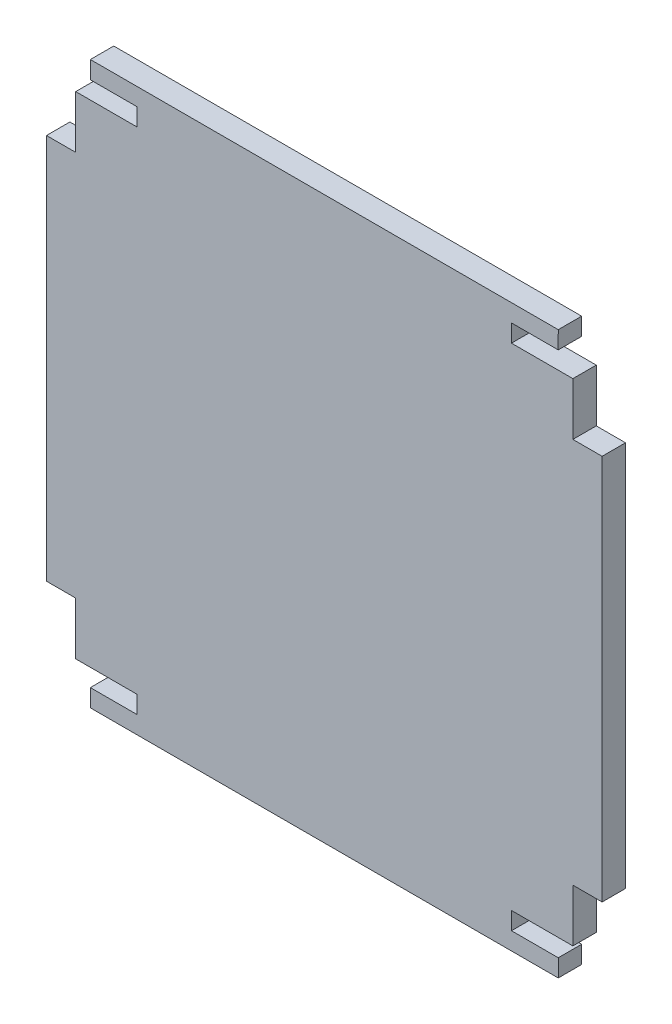
ISO-10303-21;
HEADER;
FILE_DESCRIPTION(('STEP AP214'),'2;1');
FILE_NAME('part.step','',(''),(''),'','','');
FILE_SCHEMA(('AUTOMOTIVE_DESIGN { 1 0 10303 214 1 1 1 1 }'));
ENDSEC;
DATA;
#1=APPLICATION_CONTEXT('core data for automotive mechanical design processes');
#2=APPLICATION_PROTOCOL_DEFINITION('international standard','automotive_design',2000,#1);
#3=PRODUCT_CONTEXT('',#1,'mechanical');
#4=PRODUCT('Part','Part','',(#3));
#5=PRODUCT_RELATED_PRODUCT_CATEGORY('part','',(#4));
#6=PRODUCT_DEFINITION_FORMATION('','',#4);
#7=PRODUCT_DEFINITION_CONTEXT('part definition',#1,'design');
#8=PRODUCT_DEFINITION('design','',#6,#7);
#9=PRODUCT_DEFINITION_SHAPE('','',#8);
#10=(LENGTH_UNIT() NAMED_UNIT(*) SI_UNIT(.MILLI.,.METRE.));
#11=(NAMED_UNIT(*) PLANE_ANGLE_UNIT() SI_UNIT($,.RADIAN.));
#12=(NAMED_UNIT(*) SI_UNIT($,.STERADIAN.) SOLID_ANGLE_UNIT());
#13=UNCERTAINTY_MEASURE_WITH_UNIT(LENGTH_MEASURE(1.E-05),#10,'distance_accuracy_value','');
#14=(GEOMETRIC_REPRESENTATION_CONTEXT(3) GLOBAL_UNCERTAINTY_ASSIGNED_CONTEXT((#13)) GLOBAL_UNIT_ASSIGNED_CONTEXT((#10,
#11,#12)) REPRESENTATION_CONTEXT('',''));
#15=CARTESIAN_POINT('',(0.,0.,0.));
#16=DIRECTION('',(0.,0.,1.));
#17=DIRECTION('',(1.,0.,0.));
#18=AXIS2_PLACEMENT_3D('',#15,#16,#17);
#19=CARTESIAN_POINT('',(-42.4999999508285,41.9999999081954,4.));
#20=DIRECTION('',(1.7486584931381E-08,-1.,0.));
#21=DIRECTION('',(1.,1.7486584931381E-08,0.));
#22=AXIS2_PLACEMENT_3D('',#19,#20,#21);
#23=PLANE('',#22);
#24=DIRECTION('',(-1.,-1.7486584931381E-08,0.));
#25=VECTOR('',#24,1.);
#26=CARTESIAN_POINT('',(-42.4999999508285,41.9999999081954,0.));
#27=LINE('',#26,#25);
#28=CARTESIAN_POINT('',(-31.9999999508282,42.0000000918045,0.));
#29=VERTEX_POINT('',#28);
#30=CARTESIAN_POINT('',(-42.4999999508285,41.9999999081954,0.));
#31=VERTEX_POINT('',#30);
#32=EDGE_CURVE('E257',#29,#31,#27,.T.);
#33=ORIENTED_EDGE('',*,*,#32,.T.);
#34=DIRECTION('',(0.,0.,-1.));
#35=VECTOR('',#34,1.);
#36=CARTESIAN_POINT('',(-42.4999999508285,41.9999999081954,4.));
#37=LINE('',#36,#35);
#38=CARTESIAN_POINT('',(-42.4999999508285,41.9999999081954,4.));
#39=VERTEX_POINT('',#38);
#40=EDGE_CURVE('E11',#39,#31,#37,.T.);
#41=ORIENTED_EDGE('',*,*,#40,.F.);
#42=DIRECTION('',(-1.,-1.7486584931381E-08,0.));
#43=VECTOR('',#42,1.);
#44=CARTESIAN_POINT('',(-42.4999999508285,41.9999999081954,4.));
#45=LINE('',#44,#43);
#46=CARTESIAN_POINT('',(-31.9999999508282,42.0000000918045,4.));
#47=VERTEX_POINT('',#46);
#48=EDGE_CURVE('E311',#47,#39,#45,.T.);
#49=ORIENTED_EDGE('',*,*,#48,.F.);
#50=DIRECTION('',(0.,0.,-1.));
#51=VECTOR('',#50,1.);
#52=CARTESIAN_POINT('',(-31.9999999508282,42.0000000918045,4.));
#53=LINE('',#52,#51);
#54=EDGE_CURVE('E253',#47,#29,#53,.T.);
#55=ORIENTED_EDGE('',*,*,#54,.T.);
#56=EDGE_LOOP('',(#33,#41,#49,#55));
#57=FACE_BOUND('',#56,.T.);
#58=ADVANCED_FACE('F41',(#57),#23,.F.);
#59=CARTESIAN_POINT('',(-42.4999999508285,41.9999999081954,4.));
#60=DIRECTION('',(1.,0.,0.));
#61=DIRECTION('',(0.,0.,-1.));
#62=AXIS2_PLACEMENT_3D('',#59,#60,#61);
#63=PLANE('',#62);
#64=DIRECTION('',(0.,-1.,0.));
#65=VECTOR('',#64,1.);
#66=CARTESIAN_POINT('',(-42.4999999508285,41.9999999081954,0.));
#67=LINE('',#66,#65);
#68=CARTESIAN_POINT('',(-42.4999999508285,33.0000000918047,0.));
#69=VERTEX_POINT('',#68);
#70=EDGE_CURVE('E260',#31,#69,#67,.T.);
#71=ORIENTED_EDGE('',*,*,#70,.T.);
#72=DIRECTION('',(0.,0.,-1.));
#73=VECTOR('',#72,1.);
#74=CARTESIAN_POINT('',(-42.4999999508285,33.0000000918047,4.));
#75=LINE('',#74,#73);
#76=CARTESIAN_POINT('',(-42.4999999508285,33.0000000918047,4.));
#77=VERTEX_POINT('',#76);
#78=EDGE_CURVE('E49',#77,#69,#75,.T.);
#79=ORIENTED_EDGE('',*,*,#78,.F.);
#80=DIRECTION('',(0.,-1.,0.));
#81=VECTOR('',#80,1.);
#82=CARTESIAN_POINT('',(-42.4999999508285,41.9999999081954,4.));
#83=LINE('',#82,#81);
#84=EDGE_CURVE('E160',#39,#77,#83,.T.);
#85=ORIENTED_EDGE('',*,*,#84,.F.);
#86=ORIENTED_EDGE('',*,*,#40,.T.);
#87=EDGE_LOOP('',(#71,#79,#85,#86));
#88=FACE_BOUND('',#87,.T.);
#89=ADVANCED_FACE('F469',(#88),#63,.F.);
#90=CARTESIAN_POINT('',(-42.4999999508285,33.0000000918047,4.));
#91=DIRECTION('',(0.,-1.,0.));
#92=DIRECTION('',(1.,0.,0.));
#93=AXIS2_PLACEMENT_3D('',#90,#91,#92);
#94=PLANE('',#93);
#95=DIRECTION('',(-1.,0.,0.));
#96=VECTOR('',#95,1.);
#97=CARTESIAN_POINT('',(-42.4999999508285,33.0000000918047,0.));
#98=LINE('',#97,#96);
#99=CARTESIAN_POINT('',(-47.4999999508283,33.0000000918048,0.));
#100=VERTEX_POINT('',#99);
#101=EDGE_CURVE('E262',#69,#100,#98,.T.);
#102=ORIENTED_EDGE('',*,*,#101,.T.);
#103=DIRECTION('',(0.,0.,-1.));
#104=VECTOR('',#103,1.);
#105=CARTESIAN_POINT('',(-47.4999999508283,33.0000000918048,4.));
#106=LINE('',#105,#104);
#107=CARTESIAN_POINT('',(-47.4999999508283,33.0000000918048,4.));
#108=VERTEX_POINT('',#107);
#109=EDGE_CURVE('E378',#108,#100,#106,.T.);
#110=ORIENTED_EDGE('',*,*,#109,.F.);
#111=DIRECTION('',(-1.,0.,0.));
#112=VECTOR('',#111,1.);
#113=CARTESIAN_POINT('',(-42.4999999508285,33.0000000918047,4.));
#114=LINE('',#113,#112);
#115=EDGE_CURVE('E386',#77,#108,#114,.T.);
#116=ORIENTED_EDGE('',*,*,#115,.F.);
#117=ORIENTED_EDGE('',*,*,#78,.T.);
#118=EDGE_LOOP('',(#102,#110,#116,#117));
#119=FACE_BOUND('',#118,.T.);
#120=ADVANCED_FACE('F384',(#119),#94,.F.);
#121=CARTESIAN_POINT('',(-47.4999999508283,33.0000000918048,4.));
#122=DIRECTION('',(1.,0.,0.));
#123=DIRECTION('',(0.,1.,0.));
#124=AXIS2_PLACEMENT_3D('',#121,#122,#123);
#125=PLANE('',#124);
#126=DIRECTION('',(0.,-1.,0.));
#127=VECTOR('',#126,1.);
#128=CARTESIAN_POINT('',(-47.4999999508283,33.0000000918048,0.));
#129=LINE('',#128,#127);
#130=CARTESIAN_POINT('',(-47.4999999508301,-32.9999999081952,0.));
#131=VERTEX_POINT('',#130);
#132=EDGE_CURVE('E264',#100,#131,#129,.T.);
#133=ORIENTED_EDGE('',*,*,#132,.T.);
#134=DIRECTION('',(0.,0.,-1.));
#135=VECTOR('',#134,1.);
#136=CARTESIAN_POINT('',(-47.4999999508301,-32.9999999081952,4.));
#137=LINE('',#136,#135);
#138=CARTESIAN_POINT('',(-47.4999999508301,-32.9999999081952,4.));
#139=VERTEX_POINT('',#138);
#140=EDGE_CURVE('E375',#139,#131,#137,.T.);
#141=ORIENTED_EDGE('',*,*,#140,.F.);
#142=DIRECTION('',(0.,-1.,0.));
#143=VECTOR('',#142,1.);
#144=CARTESIAN_POINT('',(-47.4999999508283,33.0000000918048,4.));
#145=LINE('',#144,#143);
#146=EDGE_CURVE('E404',#108,#139,#145,.T.);
#147=ORIENTED_EDGE('',*,*,#146,.F.);
#148=ORIENTED_EDGE('',*,*,#109,.T.);
#149=EDGE_LOOP('',(#133,#141,#147,#148));
#150=FACE_BOUND('',#149,.T.);
#151=ADVANCED_FACE('F395',(#150),#125,.F.);
#152=CARTESIAN_POINT('',(-47.4999999508301,-32.9999999081952,4.));
#153=DIRECTION('',(0.,1.,0.));
#154=DIRECTION('',(-1.,0.,0.));
#155=AXIS2_PLACEMENT_3D('',#152,#153,#154);
#156=PLANE('',#155);
#157=DIRECTION('',(1.,0.,0.));
#158=VECTOR('',#157,1.);
#159=CARTESIAN_POINT('',(-47.4999999508301,-32.9999999081952,0.));
#160=LINE('',#159,#158);
#161=CARTESIAN_POINT('',(-42.4999999508301,-32.9999999081953,0.));
#162=VERTEX_POINT('',#161);
#163=EDGE_CURVE('E266',#131,#162,#160,.T.);
#164=ORIENTED_EDGE('',*,*,#163,.T.);
#165=DIRECTION('',(0.,0.,-1.));
#166=VECTOR('',#165,1.);
#167=CARTESIAN_POINT('',(-42.4999999508301,-32.9999999081953,4.));
#168=LINE('',#167,#166);
#169=CARTESIAN_POINT('',(-42.4999999508301,-32.9999999081953,4.));
#170=VERTEX_POINT('',#169);
#171=EDGE_CURVE('E372',#170,#162,#168,.T.);
#172=ORIENTED_EDGE('',*,*,#171,.F.);
#173=DIRECTION('',(1.,0.,0.));
#174=VECTOR('',#173,1.);
#175=CARTESIAN_POINT('',(-47.4999999508301,-32.9999999081952,4.));
#176=LINE('',#175,#174);
#177=EDGE_CURVE('E401',#139,#170,#176,.T.);
#178=ORIENTED_EDGE('',*,*,#177,.F.);
#179=ORIENTED_EDGE('',*,*,#140,.T.);
#180=EDGE_LOOP('',(#164,#172,#178,#179));
#181=FACE_BOUND('',#180,.T.);
#182=ADVANCED_FACE('F399',(#181),#156,.F.);
#183=CARTESIAN_POINT('',(-42.4999999508301,-32.9999999081953,4.));
#184=DIRECTION('',(1.,1.74243335809224E-13,0.));
#185=DIRECTION('',(-1.74243335809224E-13,1.,0.));
#186=AXIS2_PLACEMENT_3D('',#183,#184,#185);
#187=PLANE('',#186);
#188=DIRECTION('',(1.74243335809224E-13,-1.,0.));
#189=VECTOR('',#188,1.);
#190=CARTESIAN_POINT('',(-42.4999999508301,-32.9999999081953,0.));
#191=LINE('',#190,#189);
#192=CARTESIAN_POINT('',(-42.4999999508285,-41.9999999081954,0.));
#193=VERTEX_POINT('',#192);
#194=EDGE_CURVE('E268',#162,#193,#191,.T.);
#195=ORIENTED_EDGE('',*,*,#194,.T.);
#196=DIRECTION('',(0.,0.,-1.));
#197=VECTOR('',#196,1.);
#198=CARTESIAN_POINT('',(-42.4999999508285,-41.9999999081954,4.));
#199=LINE('',#198,#197);
#200=CARTESIAN_POINT('',(-42.4999999508285,-41.9999999081954,4.));
#201=VERTEX_POINT('',#200);
#202=EDGE_CURVE('E369',#201,#193,#199,.T.);
#203=ORIENTED_EDGE('',*,*,#202,.F.);
#204=DIRECTION('',(1.74243335809224E-13,-1.,0.));
#205=VECTOR('',#204,1.);
#206=CARTESIAN_POINT('',(-42.4999999508301,-32.9999999081953,4.));
#207=LINE('',#206,#205);
#208=EDGE_CURVE('E403',#170,#201,#207,.T.);
#209=ORIENTED_EDGE('',*,*,#208,.F.);
#210=ORIENTED_EDGE('',*,*,#171,.T.);
#211=EDGE_LOOP('',(#195,#203,#209,#210));
#212=FACE_BOUND('',#211,.T.);
#213=ADVANCED_FACE('F482',(#212),#187,.F.);
#214=CARTESIAN_POINT('',(-42.4999999508285,-41.9999999081954,4.));
#215=DIRECTION('',(0.,1.,0.));
#216=DIRECTION('',(0.,0.,1.));
#217=AXIS2_PLACEMENT_3D('',#214,#215,#216);
#218=PLANE('',#217);
#219=DIRECTION('',(1.,0.,0.));
#220=VECTOR('',#219,1.);
#221=CARTESIAN_POINT('',(-42.4999999508285,-41.9999999081954,0.));
#222=LINE('',#221,#220);
#223=CARTESIAN_POINT('',(-31.9999999508307,-41.9999999081954,0.));
#224=VERTEX_POINT('',#223);
#225=EDGE_CURVE('E270',#193,#224,#222,.T.);
#226=ORIENTED_EDGE('',*,*,#225,.T.);
#227=DIRECTION('',(0.,0.,-1.));
#228=VECTOR('',#227,1.);
#229=CARTESIAN_POINT('',(-31.9999999508307,-41.9999999081954,4.));
#230=LINE('',#229,#228);
#231=CARTESIAN_POINT('',(-31.9999999508307,-41.9999999081954,4.));
#232=VERTEX_POINT('',#231);
#233=EDGE_CURVE('E366',#232,#224,#230,.T.);
#234=ORIENTED_EDGE('',*,*,#233,.F.);
#235=DIRECTION('',(1.,0.,0.));
#236=VECTOR('',#235,1.);
#237=CARTESIAN_POINT('',(-42.4999999508285,-41.9999999081954,4.));
#238=LINE('',#237,#236);
#239=EDGE_CURVE('E406',#201,#232,#238,.T.);
#240=ORIENTED_EDGE('',*,*,#239,.F.);
#241=ORIENTED_EDGE('',*,*,#202,.T.);
#242=EDGE_LOOP('',(#226,#234,#240,#241));
#243=FACE_BOUND('',#242,.T.);
#244=ADVANCED_FACE('F485',(#243),#218,.F.);
#245=CARTESIAN_POINT('',(-31.9999999508307,-41.9999999081954,4.));
#246=DIRECTION('',(1.,0.,0.));
#247=DIRECTION('',(0.,1.,0.));
#248=AXIS2_PLACEMENT_3D('',#245,#246,#247);
#249=PLANE('',#248);
#250=DIRECTION('',(0.,-1.,0.));
#251=VECTOR('',#250,1.);
#252=CARTESIAN_POINT('',(-31.9999999508307,-41.9999999081954,0.));
#253=LINE('',#252,#251);
#254=CARTESIAN_POINT('',(-31.9999999508308,-44.9999999081954,0.));
#255=VERTEX_POINT('',#254);
#256=EDGE_CURVE('E272',#224,#255,#253,.T.);
#257=ORIENTED_EDGE('',*,*,#256,.T.);
#258=DIRECTION('',(0.,0.,-1.));
#259=VECTOR('',#258,1.);
#260=CARTESIAN_POINT('',(-31.9999999508308,-44.9999999081954,4.));
#261=LINE('',#260,#259);
#262=CARTESIAN_POINT('',(-31.9999999508308,-44.9999999081954,4.));
#263=VERTEX_POINT('',#262);
#264=EDGE_CURVE('E363',#263,#255,#261,.T.);
#265=ORIENTED_EDGE('',*,*,#264,.F.);
#266=DIRECTION('',(0.,-1.,0.));
#267=VECTOR('',#266,1.);
#268=CARTESIAN_POINT('',(-31.9999999508307,-41.9999999081954,4.));
#269=LINE('',#268,#267);
#270=EDGE_CURVE('E412',#232,#263,#269,.T.);
#271=ORIENTED_EDGE('',*,*,#270,.F.);
#272=ORIENTED_EDGE('',*,*,#233,.T.);
#273=EDGE_LOOP('',(#257,#265,#271,#272));
#274=FACE_BOUND('',#273,.T.);
#275=ADVANCED_FACE('F489',(#274),#249,.F.);
#276=CARTESIAN_POINT('',(-39.9999999508304,-44.9999999081953,4.));
#277=DIRECTION('',(0.,-1.,0.));
#278=DIRECTION('',(1.,0.,0.));
#279=AXIS2_PLACEMENT_3D('',#276,#277,#278);
#280=PLANE('',#279);
#281=DIRECTION('',(-1.,0.,0.));
#282=VECTOR('',#281,1.);
#283=CARTESIAN_POINT('',(-39.9999999508304,-44.9999999081953,0.));
#284=LINE('',#283,#282);
#285=CARTESIAN_POINT('',(-39.9999999508304,-44.9999999081953,0.));
#286=VERTEX_POINT('',#285);
#287=EDGE_CURVE('E274',#255,#286,#284,.T.);
#288=ORIENTED_EDGE('',*,*,#287,.T.);
#289=DIRECTION('',(0.,0.,-1.));
#290=VECTOR('',#289,1.);
#291=CARTESIAN_POINT('',(-39.9999999508304,-44.9999999081953,4.));
#292=LINE('',#291,#290);
#293=CARTESIAN_POINT('',(-39.9999999508304,-44.9999999081953,4.));
#294=VERTEX_POINT('',#293);
#295=EDGE_CURVE('E360',#294,#286,#292,.T.);
#296=ORIENTED_EDGE('',*,*,#295,.F.);
#297=DIRECTION('',(-1.,0.,0.));
#298=VECTOR('',#297,1.);
#299=CARTESIAN_POINT('',(-39.9999999508304,-44.9999999081953,4.));
#300=LINE('',#299,#298);
#301=EDGE_CURVE('E414',#263,#294,#300,.T.);
#302=ORIENTED_EDGE('',*,*,#301,.F.);
#303=ORIENTED_EDGE('',*,*,#264,.T.);
#304=EDGE_LOOP('',(#288,#296,#302,#303));
#305=FACE_BOUND('',#304,.T.);
#306=ADVANCED_FACE('F493',(#305),#280,.F.);
#307=CARTESIAN_POINT('',(-39.9999999508304,-44.9999999081953,4.));
#308=DIRECTION('',(1.,0.,0.));
#309=DIRECTION('',(0.,1.,0.));
#310=AXIS2_PLACEMENT_3D('',#307,#308,#309);
#311=PLANE('',#310);
#312=DIRECTION('',(0.,-1.,0.));
#313=VECTOR('',#312,1.);
#314=CARTESIAN_POINT('',(-39.9999999508304,-44.9999999081953,0.));
#315=LINE('',#314,#313);
#316=CARTESIAN_POINT('',(-39.9999999508305,-47.9999999081953,0.));
#317=VERTEX_POINT('',#316);
#318=EDGE_CURVE('E276',#286,#317,#315,.T.);
#319=ORIENTED_EDGE('',*,*,#318,.T.);
#320=DIRECTION('',(0.,0.,-1.));
#321=VECTOR('',#320,1.);
#322=CARTESIAN_POINT('',(-39.9999999508305,-47.9999999081953,4.));
#323=LINE('',#322,#321);
#324=CARTESIAN_POINT('',(-39.9999999508305,-47.9999999081953,4.));
#325=VERTEX_POINT('',#324);
#326=EDGE_CURVE('E357',#325,#317,#323,.T.);
#327=ORIENTED_EDGE('',*,*,#326,.F.);
#328=DIRECTION('',(0.,-1.,0.));
#329=VECTOR('',#328,1.);
#330=CARTESIAN_POINT('',(-39.9999999508304,-44.9999999081953,4.));
#331=LINE('',#330,#329);
#332=EDGE_CURVE('E416',#294,#325,#331,.T.);
#333=ORIENTED_EDGE('',*,*,#332,.F.);
#334=ORIENTED_EDGE('',*,*,#295,.T.);
#335=EDGE_LOOP('',(#319,#327,#333,#334));
#336=FACE_BOUND('',#335,.T.);
#337=ADVANCED_FACE('F497',(#336),#311,.F.);
#338=CARTESIAN_POINT('',(-39.9999999508305,-47.9999999081953,4.));
#339=DIRECTION('',(0.,1.,0.));
#340=DIRECTION('',(0.,0.,1.));
#341=AXIS2_PLACEMENT_3D('',#338,#339,#340);
#342=PLANE('',#341);
#343=DIRECTION('',(1.,0.,0.));
#344=VECTOR('',#343,1.);
#345=CARTESIAN_POINT('',(-39.9999999508305,-47.9999999081953,0.));
#346=LINE('',#345,#344);
#347=CARTESIAN_POINT('',(40.0000000491695,-47.9999999081953,0.));
#348=VERTEX_POINT('',#347);
#349=EDGE_CURVE('E278',#317,#348,#346,.T.);
#350=ORIENTED_EDGE('',*,*,#349,.T.);
#351=DIRECTION('',(0.,0.,-1.));
#352=VECTOR('',#351,1.);
#353=CARTESIAN_POINT('',(40.0000000491695,-47.9999999081953,4.));
#354=LINE('',#353,#352);
#355=CARTESIAN_POINT('',(40.0000000491695,-47.9999999081953,4.));
#356=VERTEX_POINT('',#355);
#357=EDGE_CURVE('E354',#356,#348,#354,.T.);
#358=ORIENTED_EDGE('',*,*,#357,.F.);
#359=DIRECTION('',(1.,0.,0.));
#360=VECTOR('',#359,1.);
#361=CARTESIAN_POINT('',(-39.9999999508305,-47.9999999081953,4.));
#362=LINE('',#361,#360);
#363=EDGE_CURVE('E418',#325,#356,#362,.T.);
#364=ORIENTED_EDGE('',*,*,#363,.F.);
#365=ORIENTED_EDGE('',*,*,#326,.T.);
#366=EDGE_LOOP('',(#350,#358,#364,#365));
#367=FACE_BOUND('',#366,.T.);
#368=ADVANCED_FACE('F501',(#367),#342,.F.);
#369=CARTESIAN_POINT('',(40.0000000491695,-44.9999999081976,4.));
#370=DIRECTION('',(-1.,0.,0.));
#371=DIRECTION('',(0.,-1.,0.));
#372=AXIS2_PLACEMENT_3D('',#369,#370,#371);
#373=PLANE('',#372);
#374=DIRECTION('',(0.,1.,0.));
#375=VECTOR('',#374,1.);
#376=CARTESIAN_POINT('',(40.0000000491695,-44.9999999081976,0.));
#377=LINE('',#376,#375);
#378=CARTESIAN_POINT('',(40.0000000491695,-44.9999999081976,0.));
#379=VERTEX_POINT('',#378);
#380=EDGE_CURVE('E280',#348,#379,#377,.T.);
#381=ORIENTED_EDGE('',*,*,#380,.T.);
#382=DIRECTION('',(0.,0.,-1.));
#383=VECTOR('',#382,1.);
#384=CARTESIAN_POINT('',(40.0000000491695,-44.9999999081976,4.));
#385=LINE('',#384,#383);
#386=CARTESIAN_POINT('',(40.0000000491695,-44.9999999081976,4.));
#387=VERTEX_POINT('',#386);
#388=EDGE_CURVE('E351',#387,#379,#385,.T.);
#389=ORIENTED_EDGE('',*,*,#388,.F.);
#390=DIRECTION('',(0.,1.,0.));
#391=VECTOR('',#390,1.);
#392=CARTESIAN_POINT('',(40.0000000491695,-44.9999999081976,4.));
#393=LINE('',#392,#391);
#394=EDGE_CURVE('E420',#356,#387,#393,.T.);
#395=ORIENTED_EDGE('',*,*,#394,.F.);
#396=ORIENTED_EDGE('',*,*,#357,.T.);
#397=EDGE_LOOP('',(#381,#389,#395,#396));
#398=FACE_BOUND('',#397,.T.);
#399=ADVANCED_FACE('F505',(#398),#373,.F.);
#400=CARTESIAN_POINT('',(32.0000000491697,-44.9999999081971,4.));
#401=DIRECTION('',(0.,-1.,0.));
#402=DIRECTION('',(1.,0.,0.));
#403=AXIS2_PLACEMENT_3D('',#400,#401,#402);
#404=PLANE('',#403);
#405=DIRECTION('',(-1.,0.,0.));
#406=VECTOR('',#405,1.);
#407=CARTESIAN_POINT('',(32.0000000491697,-44.9999999081971,0.));
#408=LINE('',#407,#406);
#409=CARTESIAN_POINT('',(32.0000000491697,-44.9999999081971,0.));
#410=VERTEX_POINT('',#409);
#411=EDGE_CURVE('E282',#379,#410,#408,.T.);
#412=ORIENTED_EDGE('',*,*,#411,.T.);
#413=DIRECTION('',(0.,0.,-1.));
#414=VECTOR('',#413,1.);
#415=CARTESIAN_POINT('',(32.0000000491697,-44.9999999081971,4.));
#416=LINE('',#415,#414);
#417=CARTESIAN_POINT('',(32.0000000491697,-44.9999999081971,4.));
#418=VERTEX_POINT('',#417);
#419=EDGE_CURVE('E348',#418,#410,#416,.T.);
#420=ORIENTED_EDGE('',*,*,#419,.F.);
#421=DIRECTION('',(-1.,0.,0.));
#422=VECTOR('',#421,1.);
#423=CARTESIAN_POINT('',(32.0000000491697,-44.9999999081971,4.));
#424=LINE('',#423,#422);
#425=EDGE_CURVE('E422',#387,#418,#424,.T.);
#426=ORIENTED_EDGE('',*,*,#425,.F.);
#427=ORIENTED_EDGE('',*,*,#388,.T.);
#428=EDGE_LOOP('',(#412,#420,#426,#427));
#429=FACE_BOUND('',#428,.T.);
#430=ADVANCED_FACE('F509',(#429),#404,.F.);
#431=CARTESIAN_POINT('',(32.0000000491698,-41.9999999081971,4.));
#432=DIRECTION('',(-1.,0.,0.));
#433=DIRECTION('',(0.,-1.,0.));
#434=AXIS2_PLACEMENT_3D('',#431,#432,#433);
#435=PLANE('',#434);
#436=DIRECTION('',(0.,1.,0.));
#437=VECTOR('',#436,1.);
#438=CARTESIAN_POINT('',(32.0000000491698,-41.9999999081971,0.));
#439=LINE('',#438,#437);
#440=CARTESIAN_POINT('',(32.0000000491698,-41.9999999081971,0.));
#441=VERTEX_POINT('',#440);
#442=EDGE_CURVE('E284',#410,#441,#439,.T.);
#443=ORIENTED_EDGE('',*,*,#442,.T.);
#444=DIRECTION('',(0.,0.,-1.));
#445=VECTOR('',#444,1.);
#446=CARTESIAN_POINT('',(32.0000000491698,-41.9999999081971,4.));
#447=LINE('',#446,#445);
#448=CARTESIAN_POINT('',(32.0000000491698,-41.9999999081971,4.));
#449=VERTEX_POINT('',#448);
#450=EDGE_CURVE('E345',#449,#441,#447,.T.);
#451=ORIENTED_EDGE('',*,*,#450,.F.);
#452=DIRECTION('',(0.,1.,0.));
#453=VECTOR('',#452,1.);
#454=CARTESIAN_POINT('',(32.0000000491698,-41.9999999081971,4.));
#455=LINE('',#454,#453);
#456=EDGE_CURVE('E424',#418,#449,#455,.T.);
#457=ORIENTED_EDGE('',*,*,#456,.F.);
#458=ORIENTED_EDGE('',*,*,#419,.T.);
#459=EDGE_LOOP('',(#443,#451,#457,#458));
#460=FACE_BOUND('',#459,.T.);
#461=ADVANCED_FACE('F513',(#460),#435,.F.);
#462=CARTESIAN_POINT('',(42.4999999508285,-41.9999999081954,4.));
#463=DIRECTION('',(-1.63890067074872E-13,1.,0.));
#464=DIRECTION('',(-1.,-1.63890067074872E-13,0.));
#465=AXIS2_PLACEMENT_3D('',#462,#463,#464);
#466=PLANE('',#465);
#467=DIRECTION('',(1.,1.63890067074872E-13,0.));
#468=VECTOR('',#467,1.);
#469=CARTESIAN_POINT('',(42.4999999508285,-41.9999999081954,0.));
#470=LINE('',#469,#468);
#471=CARTESIAN_POINT('',(42.4999999508285,-41.9999999081954,0.));
#472=VERTEX_POINT('',#471);
#473=EDGE_CURVE('E286',#441,#472,#470,.T.);
#474=ORIENTED_EDGE('',*,*,#473,.T.);
#475=DIRECTION('',(0.,0.,-1.));
#476=VECTOR('',#475,1.);
#477=CARTESIAN_POINT('',(42.4999999508285,-41.9999999081954,4.));
#478=LINE('',#477,#476);
#479=CARTESIAN_POINT('',(42.4999999508285,-41.9999999081954,4.));
#480=VERTEX_POINT('',#479);
#481=EDGE_CURVE('E342',#480,#472,#478,.T.);
#482=ORIENTED_EDGE('',*,*,#481,.F.);
#483=DIRECTION('',(1.,1.63890067074872E-13,0.));
#484=VECTOR('',#483,1.);
#485=CARTESIAN_POINT('',(42.4999999508285,-41.9999999081954,4.));
#486=LINE('',#485,#484);
#487=EDGE_CURVE('E426',#449,#480,#486,.T.);
#488=ORIENTED_EDGE('',*,*,#487,.F.);
#489=ORIENTED_EDGE('',*,*,#450,.T.);
#490=EDGE_LOOP('',(#474,#482,#488,#489));
#491=FACE_BOUND('',#490,.T.);
#492=ADVANCED_FACE('F517',(#491),#466,.F.);
#493=CARTESIAN_POINT('',(42.5000000491701,-32.9999999081977,4.));
#494=DIRECTION('',(-1.,1.09268365960335E-08,0.));
#495=DIRECTION('',(-1.09268365960335E-08,-1.,0.));
#496=AXIS2_PLACEMENT_3D('',#493,#494,#495);
#497=PLANE('',#496);
#498=DIRECTION('',(1.09268365960335E-08,1.,0.));
#499=VECTOR('',#498,1.);
#500=CARTESIAN_POINT('',(42.5000000491701,-32.9999999081977,0.));
#501=LINE('',#500,#499);
#502=CARTESIAN_POINT('',(42.5000000491701,-32.9999999081977,0.));
#503=VERTEX_POINT('',#502);
#504=EDGE_CURVE('E288',#472,#503,#501,.T.);
#505=ORIENTED_EDGE('',*,*,#504,.T.);
#506=DIRECTION('',(0.,0.,-1.));
#507=VECTOR('',#506,1.);
#508=CARTESIAN_POINT('',(42.5000000491701,-32.9999999081977,4.));
#509=LINE('',#508,#507);
#510=CARTESIAN_POINT('',(42.5000000491701,-32.9999999081977,4.));
#511=VERTEX_POINT('',#510);
#512=EDGE_CURVE('E339',#511,#503,#509,.T.);
#513=ORIENTED_EDGE('',*,*,#512,.F.);
#514=DIRECTION('',(1.09268365960335E-08,1.,0.));
#515=VECTOR('',#514,1.);
#516=CARTESIAN_POINT('',(42.5000000491701,-32.9999999081977,4.));
#517=LINE('',#516,#515);
#518=EDGE_CURVE('E428',#480,#511,#517,.T.);
#519=ORIENTED_EDGE('',*,*,#518,.F.);
#520=ORIENTED_EDGE('',*,*,#481,.T.);
#521=EDGE_LOOP('',(#505,#513,#519,#520));
#522=FACE_BOUND('',#521,.T.);
#523=ADVANCED_FACE('F521',(#522),#497,.F.);
#524=CARTESIAN_POINT('',(47.5000000491699,-32.9999999081978,4.));
#525=DIRECTION('',(0.,1.,0.));
#526=DIRECTION('',(-1.,0.,0.));
#527=AXIS2_PLACEMENT_3D('',#524,#525,#526);
#528=PLANE('',#527);
#529=DIRECTION('',(1.,0.,0.));
#530=VECTOR('',#529,1.);
#531=CARTESIAN_POINT('',(47.5000000491699,-32.9999999081978,0.));
#532=LINE('',#531,#530);
#533=CARTESIAN_POINT('',(47.5000000491699,-32.9999999081978,0.));
#534=VERTEX_POINT('',#533);
#535=EDGE_CURVE('E290',#503,#534,#532,.T.);
#536=ORIENTED_EDGE('',*,*,#535,.T.);
#537=DIRECTION('',(0.,0.,-1.));
#538=VECTOR('',#537,1.);
#539=CARTESIAN_POINT('',(47.5000000491699,-32.9999999081978,4.));
#540=LINE('',#539,#538);
#541=CARTESIAN_POINT('',(47.5000000491699,-32.9999999081978,4.));
#542=VERTEX_POINT('',#541);
#543=EDGE_CURVE('E336',#542,#534,#540,.T.);
#544=ORIENTED_EDGE('',*,*,#543,.F.);
#545=DIRECTION('',(1.,0.,0.));
#546=VECTOR('',#545,1.);
#547=CARTESIAN_POINT('',(47.5000000491699,-32.9999999081978,4.));
#548=LINE('',#547,#546);
#549=EDGE_CURVE('E430',#511,#542,#548,.T.);
#550=ORIENTED_EDGE('',*,*,#549,.F.);
#551=ORIENTED_EDGE('',*,*,#512,.T.);
#552=EDGE_LOOP('',(#536,#544,#550,#551));
#553=FACE_BOUND('',#552,.T.);
#554=ADVANCED_FACE('F525',(#553),#528,.F.);
#555=CARTESIAN_POINT('',(47.5000000491716,33.0000000918022,4.));
#556=DIRECTION('',(-1.,0.,0.));
#557=DIRECTION('',(0.,-1.,0.));
#558=AXIS2_PLACEMENT_3D('',#555,#556,#557);
#559=PLANE('',#558);
#560=DIRECTION('',(0.,1.,0.));
#561=VECTOR('',#560,1.);
#562=CARTESIAN_POINT('',(47.5000000491716,33.0000000918022,0.));
#563=LINE('',#562,#561);
#564=CARTESIAN_POINT('',(47.5000000491716,33.0000000918022,0.));
#565=VERTEX_POINT('',#564);
#566=EDGE_CURVE('E292',#534,#565,#563,.T.);
#567=ORIENTED_EDGE('',*,*,#566,.T.);
#568=DIRECTION('',(0.,0.,-1.));
#569=VECTOR('',#568,1.);
#570=CARTESIAN_POINT('',(47.5000000491716,33.0000000918022,4.));
#571=LINE('',#570,#569);
#572=CARTESIAN_POINT('',(47.5000000491716,33.0000000918022,4.));
#573=VERTEX_POINT('',#572);
#574=EDGE_CURVE('E333',#573,#565,#571,.T.);
#575=ORIENTED_EDGE('',*,*,#574,.F.);
#576=DIRECTION('',(0.,1.,0.));
#577=VECTOR('',#576,1.);
#578=CARTESIAN_POINT('',(47.5000000491716,33.0000000918022,4.));
#579=LINE('',#578,#577);
#580=EDGE_CURVE('E432',#542,#573,#579,.T.);
#581=ORIENTED_EDGE('',*,*,#580,.F.);
#582=ORIENTED_EDGE('',*,*,#543,.T.);
#583=EDGE_LOOP('',(#567,#575,#581,#582));
#584=FACE_BOUND('',#583,.T.);
#585=ADVANCED_FACE('F529',(#584),#559,.F.);
#586=CARTESIAN_POINT('',(42.5000000491716,33.0000000918023,4.));
#587=DIRECTION('',(0.,-1.,0.));
#588=DIRECTION('',(1.,0.,0.));
#589=AXIS2_PLACEMENT_3D('',#586,#587,#588);
#590=PLANE('',#589);
#591=DIRECTION('',(-1.,0.,0.));
#592=VECTOR('',#591,1.);
#593=CARTESIAN_POINT('',(42.5000000491716,33.0000000918023,0.));
#594=LINE('',#593,#592);
#595=CARTESIAN_POINT('',(42.5000000491716,33.0000000918023,0.));
#596=VERTEX_POINT('',#595);
#597=EDGE_CURVE('E294',#565,#596,#594,.T.);
#598=ORIENTED_EDGE('',*,*,#597,.T.);
#599=DIRECTION('',(0.,0.,-1.));
#600=VECTOR('',#599,1.);
#601=CARTESIAN_POINT('',(42.5000000491716,33.0000000918023,4.));
#602=LINE('',#601,#600);
#603=CARTESIAN_POINT('',(42.5000000491716,33.0000000918023,4.));
#604=VERTEX_POINT('',#603);
#605=EDGE_CURVE('E330',#604,#596,#602,.T.);
#606=ORIENTED_EDGE('',*,*,#605,.F.);
#607=DIRECTION('',(-1.,0.,0.));
#608=VECTOR('',#607,1.);
#609=CARTESIAN_POINT('',(42.5000000491716,33.0000000918023,4.));
#610=LINE('',#609,#608);
#611=EDGE_CURVE('E434',#573,#604,#610,.T.);
#612=ORIENTED_EDGE('',*,*,#611,.F.);
#613=ORIENTED_EDGE('',*,*,#574,.T.);
#614=EDGE_LOOP('',(#598,#606,#612,#613));
#615=FACE_BOUND('',#614,.T.);
#616=ADVANCED_FACE('F533',(#615),#590,.F.);
#617=CARTESIAN_POINT('',(42.4999999508285,41.9999999081954,4.));
#618=DIRECTION('',(-1.,-1.09270095203095E-08,0.));
#619=DIRECTION('',(1.09270095203095E-08,-1.,0.));
#620=AXIS2_PLACEMENT_3D('',#617,#618,#619);
#621=PLANE('',#620);
#622=DIRECTION('',(-1.09270095203095E-08,1.,0.));
#623=VECTOR('',#622,1.);
#624=CARTESIAN_POINT('',(42.4999999508285,41.9999999081954,0.));
#625=LINE('',#624,#623);
#626=CARTESIAN_POINT('',(42.4999999508285,41.9999999081954,0.));
#627=VERTEX_POINT('',#626);
#628=EDGE_CURVE('E296',#596,#627,#625,.T.);
#629=ORIENTED_EDGE('',*,*,#628,.T.);
#630=DIRECTION('',(0.,0.,-1.));
#631=VECTOR('',#630,1.);
#632=CARTESIAN_POINT('',(42.4999999508285,41.9999999081954,4.));
#633=LINE('',#632,#631);
#634=CARTESIAN_POINT('',(42.4999999508285,41.9999999081954,4.));
#635=VERTEX_POINT('',#634);
#636=EDGE_CURVE('E327',#635,#627,#633,.T.);
#637=ORIENTED_EDGE('',*,*,#636,.F.);
#638=DIRECTION('',(-1.09270095203095E-08,1.,0.));
#639=VECTOR('',#638,1.);
#640=CARTESIAN_POINT('',(42.4999999508285,41.9999999081954,4.));
#641=LINE('',#640,#639);
#642=EDGE_CURVE('E436',#604,#635,#641,.T.);
#643=ORIENTED_EDGE('',*,*,#642,.F.);
#644=ORIENTED_EDGE('',*,*,#605,.T.);
#645=EDGE_LOOP('',(#629,#637,#643,#644));
#646=FACE_BOUND('',#645,.T.);
#647=ADVANCED_FACE('F537',(#646),#621,.F.);
#648=CARTESIAN_POINT('',(32.0000000491724,42.0000000918045,4.));
#649=DIRECTION('',(-1.74865844343152E-08,-1.,0.));
#650=DIRECTION('',(1.,-1.74865844343152E-08,0.));
#651=AXIS2_PLACEMENT_3D('',#648,#649,#650);
#652=PLANE('',#651);
#653=DIRECTION('',(-1.,1.74865844343152E-08,0.));
#654=VECTOR('',#653,1.);
#655=CARTESIAN_POINT('',(32.0000000491724,42.0000000918045,0.));
#656=LINE('',#655,#654);
#657=CARTESIAN_POINT('',(32.0000000491724,42.0000000918045,0.));
#658=VERTEX_POINT('',#657);
#659=EDGE_CURVE('E298',#627,#658,#656,.T.);
#660=ORIENTED_EDGE('',*,*,#659,.T.);
#661=DIRECTION('',(0.,0.,-1.));
#662=VECTOR('',#661,1.);
#663=CARTESIAN_POINT('',(32.0000000491724,42.0000000918045,4.));
#664=LINE('',#663,#662);
#665=CARTESIAN_POINT('',(32.0000000491724,42.0000000918045,4.));
#666=VERTEX_POINT('',#665);
#667=EDGE_CURVE('E324',#666,#658,#664,.T.);
#668=ORIENTED_EDGE('',*,*,#667,.F.);
#669=DIRECTION('',(-1.,1.74865844343152E-08,0.));
#670=VECTOR('',#669,1.);
#671=CARTESIAN_POINT('',(32.0000000491724,42.0000000918045,4.));
#672=LINE('',#671,#670);
#673=EDGE_CURVE('E438',#635,#666,#672,.T.);
#674=ORIENTED_EDGE('',*,*,#673,.F.);
#675=ORIENTED_EDGE('',*,*,#636,.T.);
#676=EDGE_LOOP('',(#660,#668,#674,#675));
#677=FACE_BOUND('',#676,.T.);
#678=ADVANCED_FACE('F541',(#677),#652,.F.);
#679=CARTESIAN_POINT('',(32.0000000491724,45.0000000918045,4.));
#680=DIRECTION('',(-1.,0.,0.));
#681=DIRECTION('',(0.,0.,1.));
#682=AXIS2_PLACEMENT_3D('',#679,#680,#681);
#683=PLANE('',#682);
#684=DIRECTION('',(0.,1.,0.));
#685=VECTOR('',#684,1.);
#686=CARTESIAN_POINT('',(32.0000000491724,45.0000000918045,0.));
#687=LINE('',#686,#685);
#688=CARTESIAN_POINT('',(32.0000000491724,45.0000000918045,0.));
#689=VERTEX_POINT('',#688);
#690=EDGE_CURVE('E300',#658,#689,#687,.T.);
#691=ORIENTED_EDGE('',*,*,#690,.T.);
#692=DIRECTION('',(0.,0.,-1.));
#693=VECTOR('',#692,1.);
#694=CARTESIAN_POINT('',(32.0000000491724,45.0000000918045,4.));
#695=LINE('',#694,#693);
#696=CARTESIAN_POINT('',(32.0000000491724,45.0000000918045,4.));
#697=VERTEX_POINT('',#696);
#698=EDGE_CURVE('E321',#697,#689,#695,.T.);
#699=ORIENTED_EDGE('',*,*,#698,.F.);
#700=DIRECTION('',(0.,1.,0.));
#701=VECTOR('',#700,1.);
#702=CARTESIAN_POINT('',(32.0000000491724,45.0000000918045,4.));
#703=LINE('',#702,#701);
#704=EDGE_CURVE('E440',#666,#697,#703,.T.);
#705=ORIENTED_EDGE('',*,*,#704,.F.);
#706=ORIENTED_EDGE('',*,*,#667,.T.);
#707=EDGE_LOOP('',(#691,#699,#705,#706));
#708=FACE_BOUND('',#707,.T.);
#709=ADVANCED_FACE('F545',(#708),#683,.F.);
#710=CARTESIAN_POINT('',(39.9960364202782,45.0000000918047,4.));
#711=DIRECTION('',(0.,1.,0.));
#712=DIRECTION('',(-1.,0.,0.));
#713=AXIS2_PLACEMENT_3D('',#710,#711,#712);
#714=PLANE('',#713);
#715=DIRECTION('',(1.,0.,0.));
#716=VECTOR('',#715,1.);
#717=CARTESIAN_POINT('',(39.9960364202782,45.0000000918047,0.));
#718=LINE('',#717,#716);
#719=CARTESIAN_POINT('',(39.9960364202782,45.0000000918047,0.));
#720=VERTEX_POINT('',#719);
#721=EDGE_CURVE('E302',#689,#720,#718,.T.);
#722=ORIENTED_EDGE('',*,*,#721,.T.);
#723=DIRECTION('',(0.,0.,-1.));
#724=VECTOR('',#723,1.);
#725=CARTESIAN_POINT('',(39.9960364202782,45.0000000918047,4.));
#726=LINE('',#725,#724);
#727=CARTESIAN_POINT('',(39.9960364202782,45.0000000918047,4.));
#728=VERTEX_POINT('',#727);
#729=EDGE_CURVE('E318',#728,#720,#726,.T.);
#730=ORIENTED_EDGE('',*,*,#729,.F.);
#731=DIRECTION('',(1.,0.,0.));
#732=VECTOR('',#731,1.);
#733=CARTESIAN_POINT('',(39.9960364202782,45.0000000918047,4.));
#734=LINE('',#733,#732);
#735=EDGE_CURVE('E442',#697,#728,#734,.T.);
#736=ORIENTED_EDGE('',*,*,#735,.F.);
#737=ORIENTED_EDGE('',*,*,#698,.T.);
#738=EDGE_LOOP('',(#722,#730,#736,#737));
#739=FACE_BOUND('',#738,.T.);
#740=ADVANCED_FACE('F549',(#739),#714,.F.);
#741=CARTESIAN_POINT('',(39.9960364202782,45.0000000918047,4.));
#742=DIRECTION('',(-0.999999127203698,0.00132120847810948,0.));
#743=DIRECTION('',(-0.00132120847810948,-0.999999127203698,0.));
#744=AXIS2_PLACEMENT_3D('',#741,#742,#743);
#745=PLANE('',#744);
#746=DIRECTION('',(0.00132120847810948,0.999999127203698,0.));
#747=VECTOR('',#746,1.);
#748=CARTESIAN_POINT('',(39.9960364202782,45.0000000918047,0.));
#749=LINE('',#748,#747);
#750=CARTESIAN_POINT('',(40.000000049172,48.0000000918024,0.));
#751=VERTEX_POINT('',#750);
#752=EDGE_CURVE('E304',#720,#751,#749,.T.);
#753=ORIENTED_EDGE('',*,*,#752,.T.);
#754=DIRECTION('',(0.,0.,-1.));
#755=VECTOR('',#754,1.);
#756=CARTESIAN_POINT('',(40.000000049172,48.0000000918024,4.));
#757=LINE('',#756,#755);
#758=CARTESIAN_POINT('',(40.000000049172,48.0000000918024,4.));
#759=VERTEX_POINT('',#758);
#760=EDGE_CURVE('E315',#759,#751,#757,.T.);
#761=ORIENTED_EDGE('',*,*,#760,.F.);
#762=DIRECTION('',(0.00132120847810948,0.999999127203698,0.));
#763=VECTOR('',#762,1.);
#764=CARTESIAN_POINT('',(39.9960364202782,45.0000000918047,4.));
#765=LINE('',#764,#763);
#766=EDGE_CURVE('E444',#728,#759,#765,.T.);
#767=ORIENTED_EDGE('',*,*,#766,.F.);
#768=ORIENTED_EDGE('',*,*,#729,.T.);
#769=EDGE_LOOP('',(#753,#761,#767,#768));
#770=FACE_BOUND('',#769,.T.);
#771=ADVANCED_FACE('F450',(#770),#745,.F.);
#772=CARTESIAN_POINT('',(40.000000049172,48.0000000918024,4.));
#773=DIRECTION('',(0.,-1.,0.));
#774=DIRECTION('',(1.,0.,0.));
#775=AXIS2_PLACEMENT_3D('',#772,#773,#774);
#776=PLANE('',#775);
#777=DIRECTION('',(-1.,0.,0.));
#778=VECTOR('',#777,1.);
#779=CARTESIAN_POINT('',(40.000000049172,48.0000000918024,0.));
#780=LINE('',#779,#778);
#781=CARTESIAN_POINT('',(-39.999999950828,48.0000000918047,0.));
#782=VERTEX_POINT('',#781);
#783=EDGE_CURVE('E306',#751,#782,#780,.T.);
#784=ORIENTED_EDGE('',*,*,#783,.T.);
#785=DIRECTION('',(0.,0.,-1.));
#786=VECTOR('',#785,1.);
#787=CARTESIAN_POINT('',(-39.999999950828,48.0000000918047,4.));
#788=LINE('',#787,#786);
#789=CARTESIAN_POINT('',(-39.999999950828,48.0000000918047,4.));
#790=VERTEX_POINT('',#789);
#791=EDGE_CURVE('E248',#790,#782,#788,.T.);
#792=ORIENTED_EDGE('',*,*,#791,.F.);
#793=DIRECTION('',(-1.,0.,0.));
#794=VECTOR('',#793,1.);
#795=CARTESIAN_POINT('',(40.000000049172,48.0000000918024,4.));
#796=LINE('',#795,#794);
#797=EDGE_CURVE('E239',#759,#790,#796,.T.);
#798=ORIENTED_EDGE('',*,*,#797,.F.);
#799=ORIENTED_EDGE('',*,*,#760,.T.);
#800=EDGE_LOOP('',(#784,#792,#798,#799));
#801=FACE_BOUND('',#800,.T.);
#802=ADVANCED_FACE('F454',(#801),#776,.F.);
#803=CARTESIAN_POINT('',(-39.999999950828,48.0000000918047,4.));
#804=DIRECTION('',(1.,0.,0.));
#805=DIRECTION('',(0.,1.,0.));
#806=AXIS2_PLACEMENT_3D('',#803,#804,#805);
#807=PLANE('',#806);
#808=DIRECTION('',(0.,-1.,0.));
#809=VECTOR('',#808,1.);
#810=CARTESIAN_POINT('',(-39.999999950828,48.0000000918047,0.));
#811=LINE('',#810,#809);
#812=CARTESIAN_POINT('',(-39.999999950828,45.0000000918047,0.));
#813=VERTEX_POINT('',#812);
#814=EDGE_CURVE('E247',#782,#813,#811,.T.);
#815=ORIENTED_EDGE('',*,*,#814,.T.);
#816=DIRECTION('',(0.,0.,-1.));
#817=VECTOR('',#816,1.);
#818=CARTESIAN_POINT('',(-39.999999950828,45.0000000918047,4.));
#819=LINE('',#818,#817);
#820=CARTESIAN_POINT('',(-39.999999950828,45.0000000918047,4.));
#821=VERTEX_POINT('',#820);
#822=EDGE_CURVE('E244',#821,#813,#819,.T.);
#823=ORIENTED_EDGE('',*,*,#822,.F.);
#824=DIRECTION('',(0.,-1.,0.));
#825=VECTOR('',#824,1.);
#826=CARTESIAN_POINT('',(-39.999999950828,48.0000000918047,4.));
#827=LINE('',#826,#825);
#828=EDGE_CURVE('E233',#790,#821,#827,.T.);
#829=ORIENTED_EDGE('',*,*,#828,.F.);
#830=ORIENTED_EDGE('',*,*,#791,.T.);
#831=EDGE_LOOP('',(#815,#823,#829,#830));
#832=FACE_BOUND('',#831,.T.);
#833=ADVANCED_FACE('F245',(#832),#807,.F.);
#834=CARTESIAN_POINT('',(-31.9999999508282,45.0000000918045,4.));
#835=DIRECTION('',(0.,1.,0.));
#836=DIRECTION('',(-1.,0.,0.));
#837=AXIS2_PLACEMENT_3D('',#834,#835,#836);
#838=PLANE('',#837);
#839=DIRECTION('',(1.,0.,0.));
#840=VECTOR('',#839,1.);
#841=CARTESIAN_POINT('',(-31.9999999508282,45.0000000918045,0.));
#842=LINE('',#841,#840);
#843=CARTESIAN_POINT('',(-31.9999999508282,45.0000000918045,0.));
#844=VERTEX_POINT('',#843);
#845=EDGE_CURVE('E146',#813,#844,#842,.T.);
#846=ORIENTED_EDGE('',*,*,#845,.T.);
#847=DIRECTION('',(0.,0.,-1.));
#848=VECTOR('',#847,1.);
#849=CARTESIAN_POINT('',(-31.9999999508282,45.0000000918045,4.));
#850=LINE('',#849,#848);
#851=CARTESIAN_POINT('',(-31.9999999508282,45.0000000918045,4.));
#852=VERTEX_POINT('',#851);
#853=EDGE_CURVE('E249',#852,#844,#850,.T.);
#854=ORIENTED_EDGE('',*,*,#853,.F.);
#855=DIRECTION('',(1.,0.,0.));
#856=VECTOR('',#855,1.);
#857=CARTESIAN_POINT('',(-31.9999999508282,45.0000000918045,4.));
#858=LINE('',#857,#856);
#859=EDGE_CURVE('E237',#821,#852,#858,.T.);
#860=ORIENTED_EDGE('',*,*,#859,.F.);
#861=ORIENTED_EDGE('',*,*,#822,.T.);
#862=EDGE_LOOP('',(#846,#854,#860,#861));
#863=FACE_BOUND('',#862,.T.);
#864=ADVANCED_FACE('F251',(#863),#838,.F.);
#865=CARTESIAN_POINT('',(-31.9999999508282,42.0000000918045,4.));
#866=DIRECTION('',(1.,0.,0.));
#867=DIRECTION('',(0.,0.,-1.));
#868=AXIS2_PLACEMENT_3D('',#865,#866,#867);
#869=PLANE('',#868);
#870=DIRECTION('',(0.,-1.,0.));
#871=VECTOR('',#870,1.);
#872=CARTESIAN_POINT('',(-31.9999999508282,42.0000000918045,0.));
#873=LINE('',#872,#871);
#874=EDGE_CURVE('E152',#844,#29,#873,.T.);
#875=ORIENTED_EDGE('',*,*,#874,.T.);
#876=ORIENTED_EDGE('',*,*,#54,.F.);
#877=DIRECTION('',(0.,-1.,0.));
#878=VECTOR('',#877,1.);
#879=CARTESIAN_POINT('',(-31.9999999508282,42.0000000918045,4.));
#880=LINE('',#879,#878);
#881=EDGE_CURVE('E57',#852,#47,#880,.T.);
#882=ORIENTED_EDGE('',*,*,#881,.F.);
#883=ORIENTED_EDGE('',*,*,#853,.T.);
#884=EDGE_LOOP('',(#875,#876,#882,#883));
#885=FACE_BOUND('',#884,.T.);
#886=ADVANCED_FACE('F458',(#885),#869,.F.);
#887=CARTESIAN_POINT('',(0.,0.,4.));
#888=DIRECTION('',(0.,0.,-1.));
#889=DIRECTION('',(-1.,0.,0.));
#890=AXIS2_PLACEMENT_3D('',#887,#888,#889);
#891=PLANE('',#890);
#892=ORIENTED_EDGE('',*,*,#48,.T.);
#893=ORIENTED_EDGE('',*,*,#84,.T.);
#894=ORIENTED_EDGE('',*,*,#115,.T.);
#895=ORIENTED_EDGE('',*,*,#146,.T.);
#896=ORIENTED_EDGE('',*,*,#177,.T.);
#897=ORIENTED_EDGE('',*,*,#208,.T.);
#898=ORIENTED_EDGE('',*,*,#239,.T.);
#899=ORIENTED_EDGE('',*,*,#270,.T.);
#900=ORIENTED_EDGE('',*,*,#301,.T.);
#901=ORIENTED_EDGE('',*,*,#332,.T.);
#902=ORIENTED_EDGE('',*,*,#363,.T.);
#903=ORIENTED_EDGE('',*,*,#394,.T.);
#904=ORIENTED_EDGE('',*,*,#425,.T.);
#905=ORIENTED_EDGE('',*,*,#456,.T.);
#906=ORIENTED_EDGE('',*,*,#487,.T.);
#907=ORIENTED_EDGE('',*,*,#518,.T.);
#908=ORIENTED_EDGE('',*,*,#549,.T.);
#909=ORIENTED_EDGE('',*,*,#580,.T.);
#910=ORIENTED_EDGE('',*,*,#611,.T.);
#911=ORIENTED_EDGE('',*,*,#642,.T.);
#912=ORIENTED_EDGE('',*,*,#673,.T.);
#913=ORIENTED_EDGE('',*,*,#704,.T.);
#914=ORIENTED_EDGE('',*,*,#735,.T.);
#915=ORIENTED_EDGE('',*,*,#766,.T.);
#916=ORIENTED_EDGE('',*,*,#797,.T.);
#917=ORIENTED_EDGE('',*,*,#828,.T.);
#918=ORIENTED_EDGE('',*,*,#859,.T.);
#919=ORIENTED_EDGE('',*,*,#881,.T.);
#920=EDGE_LOOP('',(#892,#893,#894,#895,#896,#897,#898,#899,#900,#901,#902,#903,#904,#905,#906,
#907,#908,#909,#910,#911,#912,#913,#914,#915,#916,#917,#918,#919));
#921=FACE_BOUND('',#920,.T.);
#922=ADVANCED_FACE('F235',(#921),#891,.F.);
#923=CARTESIAN_POINT('',(0.,0.,0.));
#924=DIRECTION('',(0.,0.,-1.));
#925=DIRECTION('',(-1.,0.,0.));
#926=AXIS2_PLACEMENT_3D('',#923,#924,#925);
#927=PLANE('',#926);
#928=ORIENTED_EDGE('',*,*,#32,.F.);
#929=ORIENTED_EDGE('',*,*,#874,.F.);
#930=ORIENTED_EDGE('',*,*,#845,.F.);
#931=ORIENTED_EDGE('',*,*,#814,.F.);
#932=ORIENTED_EDGE('',*,*,#783,.F.);
#933=ORIENTED_EDGE('',*,*,#752,.F.);
#934=ORIENTED_EDGE('',*,*,#721,.F.);
#935=ORIENTED_EDGE('',*,*,#690,.F.);
#936=ORIENTED_EDGE('',*,*,#659,.F.);
#937=ORIENTED_EDGE('',*,*,#628,.F.);
#938=ORIENTED_EDGE('',*,*,#597,.F.);
#939=ORIENTED_EDGE('',*,*,#566,.F.);
#940=ORIENTED_EDGE('',*,*,#535,.F.);
#941=ORIENTED_EDGE('',*,*,#504,.F.);
#942=ORIENTED_EDGE('',*,*,#473,.F.);
#943=ORIENTED_EDGE('',*,*,#442,.F.);
#944=ORIENTED_EDGE('',*,*,#411,.F.);
#945=ORIENTED_EDGE('',*,*,#380,.F.);
#946=ORIENTED_EDGE('',*,*,#349,.F.);
#947=ORIENTED_EDGE('',*,*,#318,.F.);
#948=ORIENTED_EDGE('',*,*,#287,.F.);
#949=ORIENTED_EDGE('',*,*,#256,.F.);
#950=ORIENTED_EDGE('',*,*,#225,.F.);
#951=ORIENTED_EDGE('',*,*,#194,.F.);
#952=ORIENTED_EDGE('',*,*,#163,.F.);
#953=ORIENTED_EDGE('',*,*,#132,.F.);
#954=ORIENTED_EDGE('',*,*,#101,.F.);
#955=ORIENTED_EDGE('',*,*,#70,.F.);
#956=EDGE_LOOP('',(#928,#929,#930,#931,#932,#933,#934,#935,#936,#937,#938,#939,#940,#941,#942,
#943,#944,#945,#946,#947,#948,#949,#950,#951,#952,#953,#954,#955));
#957=FACE_BOUND('',#956,.T.);
#958=ADVANCED_FACE('F390',(#957),#927,.T.);
#959=CLOSED_SHELL('',(#58,#89,#120,#151,#182,#213,#244,#275,#306,#337,#368,#399,#430,#461,#492,
#523,#554,#585,#616,#647,#678,#709,#740,#771,#802,#833,#864,#886,#922,#958));
#960=MANIFOLD_SOLID_BREP('B2',#959);
#961=ADVANCED_BREP_SHAPE_REPRESENTATION('',(#18,#960),#14);
#962=SHAPE_DEFINITION_REPRESENTATION(#9,#961);
ENDSEC;
END-ISO-10303-21;
